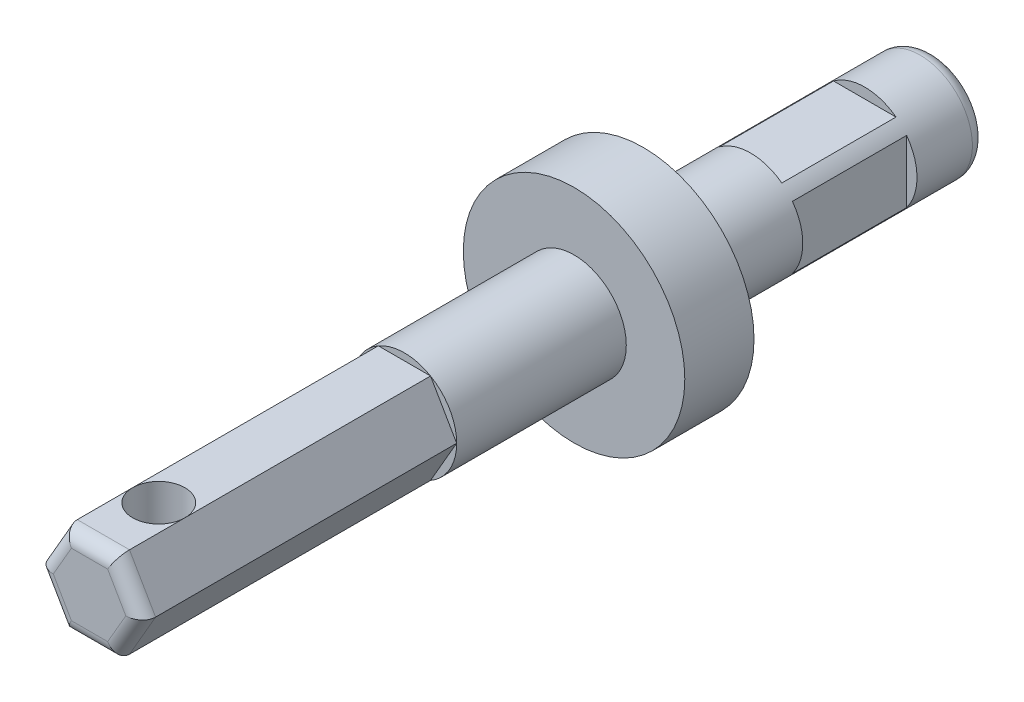
ISO-10303-21;
HEADER;
FILE_DESCRIPTION(('STEP AP214'),'2;1');
FILE_NAME('part.step','',(''),(''),'','','');
FILE_SCHEMA(('AUTOMOTIVE_DESIGN { 1 0 10303 214 1 1 1 1 }'));
ENDSEC;
DATA;
#1=APPLICATION_CONTEXT('core data for automotive mechanical design processes');
#2=APPLICATION_PROTOCOL_DEFINITION('international standard','automotive_design',2000,#1);
#3=PRODUCT_CONTEXT('',#1,'mechanical');
#4=PRODUCT('Part','Part','',(#3));
#5=PRODUCT_RELATED_PRODUCT_CATEGORY('part','',(#4));
#6=PRODUCT_DEFINITION_FORMATION('','',#4);
#7=PRODUCT_DEFINITION_CONTEXT('part definition',#1,'design');
#8=PRODUCT_DEFINITION('design','',#6,#7);
#9=PRODUCT_DEFINITION_SHAPE('','',#8);
#10=(LENGTH_UNIT() NAMED_UNIT(*) SI_UNIT(.MILLI.,.METRE.));
#11=(NAMED_UNIT(*) PLANE_ANGLE_UNIT() SI_UNIT($,.RADIAN.));
#12=(NAMED_UNIT(*) SI_UNIT($,.STERADIAN.) SOLID_ANGLE_UNIT());
#13=UNCERTAINTY_MEASURE_WITH_UNIT(LENGTH_MEASURE(1.E-05),#10,'distance_accuracy_value','');
#14=(GEOMETRIC_REPRESENTATION_CONTEXT(3) GLOBAL_UNCERTAINTY_ASSIGNED_CONTEXT((#13)) GLOBAL_UNIT_ASSIGNED_CONTEXT((#10,
#11,#12)) REPRESENTATION_CONTEXT('',''));
#15=CARTESIAN_POINT('',(0.,0.,0.));
#16=DIRECTION('',(0.,0.,1.));
#17=DIRECTION('',(1.,0.,0.));
#18=AXIS2_PLACEMENT_3D('',#15,#16,#17);
#19=CARTESIAN_POINT('',(1.8865,3.26751384847869,46.));
#20=DIRECTION('',(0.,-1.,0.));
#21=DIRECTION('',(1.,0.,0.));
#22=AXIS2_PLACEMENT_3D('',#19,#20,#21);
#23=PLANE('',#22);
#24=DIRECTION('',(0.,0.,-1.));
#25=VECTOR('',#24,1.);
#26=CARTESIAN_POINT('',(-1.8865,3.26751384847869,46.));
#27=LINE('',#26,#25);
#28=CARTESIAN_POINT('',(-1.8865,3.26751384847869,55.));
#29=VERTEX_POINT('',#28);
#30=CARTESIAN_POINT('',(-1.8865,3.26751384847869,51.));
#31=VERTEX_POINT('',#30);
#32=EDGE_CURVE('E151',#29,#31,#27,.T.);
#33=ORIENTED_EDGE('',*,*,#32,.F.);
#34=DIRECTION('',(-1.,0.,0.));
#35=VECTOR('',#34,1.);
#36=CARTESIAN_POINT('',(1.8865,3.26751384847869,55.));
#37=LINE('',#36,#35);
#38=CARTESIAN_POINT('',(1.8865,3.26751384847869,55.));
#39=VERTEX_POINT('',#38);
#40=EDGE_CURVE('E277',#29,#39,#37,.F.);
#41=ORIENTED_EDGE('',*,*,#40,.T.);
#42=DIRECTION('',(0.,0.,-1.));
#43=VECTOR('',#42,1.);
#44=CARTESIAN_POINT('',(1.8865,3.26751384847869,46.));
#45=LINE('',#44,#43);
#46=CARTESIAN_POINT('',(1.8865,3.26751384847869,51.));
#47=VERTEX_POINT('',#46);
#48=EDGE_CURVE('E179',#39,#47,#45,.T.);
#49=ORIENTED_EDGE('',*,*,#48,.T.);
#50=CARTESIAN_POINT('',(0.,3.26751384847869,51.));
#51=DIRECTION('',(0.,1.,0.));
#52=DIRECTION('',(-1.,0.,0.));
#53=AXIS2_PLACEMENT_3D('',#50,#51,#52);
#54=CIRCLE('',#53,1.8865);
#55=EDGE_CURVE('E173',#31,#47,#54,.T.);
#56=ORIENTED_EDGE('',*,*,#55,.F.);
#57=EDGE_LOOP('',(#33,#41,#49,#56));
#58=FACE_BOUND('',#57,.T.);
#59=ADVANCED_FACE('F44',(#58),#23,.F.);
#60=CARTESIAN_POINT('',(-1.8865,-3.26751384847869,46.));
#61=DIRECTION('',(0.,1.,0.));
#62=DIRECTION('',(-1.,0.,0.));
#63=AXIS2_PLACEMENT_3D('',#60,#61,#62);
#64=PLANE('',#63);
#65=DIRECTION('',(0.,0.,-1.));
#66=VECTOR('',#65,1.);
#67=CARTESIAN_POINT('',(1.8865,-3.26751384847869,46.));
#68=LINE('',#67,#66);
#69=CARTESIAN_POINT('',(1.8865,-3.26751384847869,55.));
#70=VERTEX_POINT('',#69);
#71=CARTESIAN_POINT('',(1.8865,-3.26751384847868,51.));
#72=VERTEX_POINT('',#71);
#73=EDGE_CURVE('E347',#70,#72,#68,.T.);
#74=ORIENTED_EDGE('',*,*,#73,.F.);
#75=DIRECTION('',(1.,0.,0.));
#76=VECTOR('',#75,1.);
#77=CARTESIAN_POINT('',(-1.8865,-3.26751384847869,55.));
#78=LINE('',#77,#76);
#79=CARTESIAN_POINT('',(-1.8865,-3.26751384847869,55.));
#80=VERTEX_POINT('',#79);
#81=EDGE_CURVE('E11',#70,#80,#78,.F.);
#82=ORIENTED_EDGE('',*,*,#81,.T.);
#83=DIRECTION('',(0.,0.,-1.));
#84=VECTOR('',#83,1.);
#85=CARTESIAN_POINT('',(-1.8865,-3.26751384847869,46.));
#86=LINE('',#85,#84);
#87=CARTESIAN_POINT('',(-1.8865,-3.26751384847869,51.));
#88=VERTEX_POINT('',#87);
#89=EDGE_CURVE('E189',#80,#88,#86,.T.);
#90=ORIENTED_EDGE('',*,*,#89,.T.);
#91=CARTESIAN_POINT('',(0.,-3.26751384847869,51.));
#92=DIRECTION('',(0.,1.,0.));
#93=DIRECTION('',(-1.,0.,0.));
#94=AXIS2_PLACEMENT_3D('',#91,#92,#93);
#95=CIRCLE('',#94,1.8865);
#96=EDGE_CURVE('E392',#88,#72,#95,.T.);
#97=ORIENTED_EDGE('',*,*,#96,.T.);
#98=EDGE_LOOP('',(#74,#82,#90,#97));
#99=FACE_BOUND('',#98,.T.);
#100=ADVANCED_FACE('F398',(#99),#64,.F.);
#101=CARTESIAN_POINT('',(0.,0.,8.25));
#102=DIRECTION('',(0.,0.,-1.));
#103=DIRECTION('',(-1.,0.,0.));
#104=AXIS2_PLACEMENT_3D('',#101,#102,#103);
#105=CYLINDRICAL_SURFACE('',#104,3.773);
#106=CARTESIAN_POINT('',(0.,0.,21.));
#107=DIRECTION('',(0.,0.,1.));
#108=DIRECTION('',(1.,0.,0.));
#109=AXIS2_PLACEMENT_3D('',#106,#107,#108);
#110=CIRCLE('',#109,3.773);
#111=CARTESIAN_POINT('',(3.773,0.,21.));
#112=VERTEX_POINT('',#111);
#113=EDGE_CURVE('E249',#112,#112,#110,.T.);
#114=ORIENTED_EDGE('',*,*,#113,.T.);
#115=EDGE_LOOP('',(#114));
#116=FACE_BOUND('',#115,.T.);
#117=CARTESIAN_POINT('',(0.,0.,33.254));
#118=DIRECTION('',(0.,0.,1.));
#119=DIRECTION('',(1.,0.,0.));
#120=AXIS2_PLACEMENT_3D('',#117,#118,#119);
#121=CIRCLE('',#120,3.773);
#122=CARTESIAN_POINT('',(1.8865,-3.26751384847869,33.254));
#123=VERTEX_POINT('',#122);
#124=CARTESIAN_POINT('',(3.773,0.,33.254));
#125=VERTEX_POINT('',#124);
#126=EDGE_CURVE('E373',#123,#125,#121,.T.);
#127=ORIENTED_EDGE('',*,*,#126,.F.);
#128=CARTESIAN_POINT('',(-1.8865,-3.26751384847869,33.254));
#129=VERTEX_POINT('',#128);
#130=EDGE_CURVE('E364',#129,#123,#121,.T.);
#131=ORIENTED_EDGE('',*,*,#130,.F.);
#132=CARTESIAN_POINT('',(-3.773,0.,33.254));
#133=VERTEX_POINT('',#132);
#134=EDGE_CURVE('E370',#133,#129,#121,.T.);
#135=ORIENTED_EDGE('',*,*,#134,.F.);
#136=CARTESIAN_POINT('',(-1.8865,3.26751384847869,33.254));
#137=VERTEX_POINT('',#136);
#138=EDGE_CURVE('E378',#137,#133,#121,.T.);
#139=ORIENTED_EDGE('',*,*,#138,.F.);
#140=CARTESIAN_POINT('',(1.8865,3.26751384847869,33.254));
#141=VERTEX_POINT('',#140);
#142=EDGE_CURVE('E380',#141,#137,#121,.T.);
#143=ORIENTED_EDGE('',*,*,#142,.F.);
#144=EDGE_CURVE('E332',#125,#141,#121,.T.);
#145=ORIENTED_EDGE('',*,*,#144,.F.);
#146=EDGE_LOOP('',(#127,#131,#135,#139,#143,#145));
#147=FACE_BOUND('',#146,.T.);
#148=ADVANCED_FACE('F369',(#116,#147),#105,.T.);
#149=CARTESIAN_POINT('',(0.,0.,33.254));
#150=DIRECTION('',(0.,0.,1.));
#151=DIRECTION('',(1.,0.,0.));
#152=AXIS2_PLACEMENT_3D('',#149,#150,#151);
#153=PLANE('',#152);
#154=DIRECTION('',(0.5,0.866025403784439,0.));
#155=VECTOR('',#154,1.);
#156=CARTESIAN_POINT('',(1.8865,-3.26751384847869,33.254));
#157=LINE('',#156,#155);
#158=EDGE_CURVE('E339',#123,#125,#157,.T.);
#159=ORIENTED_EDGE('',*,*,#158,.F.);
#160=ORIENTED_EDGE('',*,*,#126,.T.);
#161=EDGE_LOOP('',(#159,#160));
#162=FACE_BOUND('',#161,.T.);
#163=ADVANCED_FACE('F403',(#162),#153,.T.);
#164=DIRECTION('',(1.,0.,0.));
#165=VECTOR('',#164,1.);
#166=CARTESIAN_POINT('',(-1.8865,-3.26751384847869,33.254));
#167=LINE('',#166,#165);
#168=EDGE_CURVE('E330',#129,#123,#167,.T.);
#169=ORIENTED_EDGE('',*,*,#168,.F.);
#170=ORIENTED_EDGE('',*,*,#130,.T.);
#171=EDGE_LOOP('',(#169,#170));
#172=FACE_BOUND('',#171,.T.);
#173=ADVANCED_FACE('F363',(#172),#153,.T.);
#174=DIRECTION('',(0.5,-0.866025403784439,0.));
#175=VECTOR('',#174,1.);
#176=CARTESIAN_POINT('',(-3.773,0.,33.254));
#177=LINE('',#176,#175);
#178=EDGE_CURVE('E326',#133,#129,#177,.T.);
#179=ORIENTED_EDGE('',*,*,#178,.F.);
#180=ORIENTED_EDGE('',*,*,#134,.T.);
#181=EDGE_LOOP('',(#179,#180));
#182=FACE_BOUND('',#181,.T.);
#183=ADVANCED_FACE('F376',(#182),#153,.T.);
#184=DIRECTION('',(-0.5,-0.866025403784439,0.));
#185=VECTOR('',#184,1.);
#186=CARTESIAN_POINT('',(-1.8865,3.26751384847869,33.254));
#187=LINE('',#186,#185);
#188=EDGE_CURVE('E321',#137,#133,#187,.T.);
#189=ORIENTED_EDGE('',*,*,#188,.F.);
#190=ORIENTED_EDGE('',*,*,#138,.T.);
#191=EDGE_LOOP('',(#189,#190));
#192=FACE_BOUND('',#191,.T.);
#193=ADVANCED_FACE('F622',(#192),#153,.T.);
#194=DIRECTION('',(-1.,0.,0.));
#195=VECTOR('',#194,1.);
#196=CARTESIAN_POINT('',(1.8865,3.26751384847869,33.254));
#197=LINE('',#196,#195);
#198=EDGE_CURVE('E185',#141,#137,#197,.T.);
#199=ORIENTED_EDGE('',*,*,#198,.F.);
#200=ORIENTED_EDGE('',*,*,#142,.T.);
#201=EDGE_LOOP('',(#199,#200));
#202=FACE_BOUND('',#201,.T.);
#203=ADVANCED_FACE('F455',(#202),#153,.T.);
#204=DIRECTION('',(-0.5,0.866025403784439,0.));
#205=VECTOR('',#204,1.);
#206=CARTESIAN_POINT('',(3.773,0.,33.254));
#207=LINE('',#206,#205);
#208=EDGE_CURVE('E232',#125,#141,#207,.T.);
#209=ORIENTED_EDGE('',*,*,#208,.F.);
#210=ORIENTED_EDGE('',*,*,#144,.T.);
#211=EDGE_LOOP('',(#209,#210));
#212=FACE_BOUND('',#211,.T.);
#213=ADVANCED_FACE('F409',(#212),#153,.T.);
#214=CARTESIAN_POINT('',(3.773,0.,46.));
#215=DIRECTION('',(-0.866025403784438,-0.5,0.));
#216=DIRECTION('',(0.5,-0.866025403784439,0.));
#217=AXIS2_PLACEMENT_3D('',#214,#215,#216);
#218=PLANE('',#217);
#219=ORIENTED_EDGE('',*,*,#48,.F.);
#220=DIRECTION('',(-0.5,0.866025403784439,0.));
#221=VECTOR('',#220,1.);
#222=CARTESIAN_POINT('',(3.773,0.,55.));
#223=LINE('',#222,#221);
#224=CARTESIAN_POINT('',(3.773,0.,55.));
#225=VERTEX_POINT('',#224);
#226=EDGE_CURVE('E273',#39,#225,#223,.F.);
#227=ORIENTED_EDGE('',*,*,#226,.T.);
#228=DIRECTION('',(0.,0.,-1.));
#229=VECTOR('',#228,1.);
#230=CARTESIAN_POINT('',(3.773,0.,46.));
#231=LINE('',#230,#229);
#232=EDGE_CURVE('E343',#225,#125,#231,.T.);
#233=ORIENTED_EDGE('',*,*,#232,.T.);
#234=ORIENTED_EDGE('',*,*,#208,.T.);
#235=EDGE_CURVE('E165',#47,#141,#45,.T.);
#236=ORIENTED_EDGE('',*,*,#235,.F.);
#237=EDGE_LOOP('',(#219,#227,#233,#234,#236));
#238=FACE_BOUND('',#237,.T.);
#239=ADVANCED_FACE('F411',(#238),#218,.F.);
#240=EDGE_CURVE('E157',#31,#137,#27,.T.);
#241=ORIENTED_EDGE('',*,*,#240,.F.);
#242=EDGE_CURVE('E170',#47,#31,#54,.T.);
#243=ORIENTED_EDGE('',*,*,#242,.F.);
#244=ORIENTED_EDGE('',*,*,#235,.T.);
#245=ORIENTED_EDGE('',*,*,#198,.T.);
#246=EDGE_LOOP('',(#241,#243,#244,#245));
#247=FACE_BOUND('',#246,.T.);
#248=ADVANCED_FACE('F183',(#247),#23,.F.);
#249=CARTESIAN_POINT('',(-1.8865,3.26751384847869,46.));
#250=DIRECTION('',(0.866025403784439,-0.5,0.));
#251=DIRECTION('',(0.5,0.866025403784439,0.));
#252=AXIS2_PLACEMENT_3D('',#249,#250,#251);
#253=PLANE('',#252);
#254=DIRECTION('',(0.,0.,-1.));
#255=VECTOR('',#254,1.);
#256=CARTESIAN_POINT('',(-3.773,0.,46.));
#257=LINE('',#256,#255);
#258=CARTESIAN_POINT('',(-3.773,0.,55.));
#259=VERTEX_POINT('',#258);
#260=EDGE_CURVE('E187',#259,#133,#257,.T.);
#261=ORIENTED_EDGE('',*,*,#260,.F.);
#262=DIRECTION('',(-0.5,-0.866025403784439,0.));
#263=VECTOR('',#262,1.);
#264=CARTESIAN_POINT('',(-1.8865,3.26751384847869,55.));
#265=LINE('',#264,#263);
#266=EDGE_CURVE('E160',#259,#29,#265,.F.);
#267=ORIENTED_EDGE('',*,*,#266,.T.);
#268=ORIENTED_EDGE('',*,*,#32,.T.);
#269=ORIENTED_EDGE('',*,*,#240,.T.);
#270=ORIENTED_EDGE('',*,*,#188,.T.);
#271=EDGE_LOOP('',(#261,#267,#268,#269,#270));
#272=FACE_BOUND('',#271,.T.);
#273=ADVANCED_FACE('F154',(#272),#253,.F.);
#274=CARTESIAN_POINT('',(-3.773,0.,46.));
#275=DIRECTION('',(0.866025403784438,0.5,0.));
#276=DIRECTION('',(-0.5,0.866025403784439,0.));
#277=AXIS2_PLACEMENT_3D('',#274,#275,#276);
#278=PLANE('',#277);
#279=ORIENTED_EDGE('',*,*,#89,.F.);
#280=DIRECTION('',(0.5,-0.866025403784439,0.));
#281=VECTOR('',#280,1.);
#282=CARTESIAN_POINT('',(-3.773,0.,55.));
#283=LINE('',#282,#281);
#284=EDGE_CURVE('E282',#80,#259,#283,.F.);
#285=ORIENTED_EDGE('',*,*,#284,.T.);
#286=ORIENTED_EDGE('',*,*,#260,.T.);
#287=ORIENTED_EDGE('',*,*,#178,.T.);
#288=EDGE_CURVE('E349',#88,#129,#86,.T.);
#289=ORIENTED_EDGE('',*,*,#288,.F.);
#290=EDGE_LOOP('',(#279,#285,#286,#287,#289));
#291=FACE_BOUND('',#290,.T.);
#292=ADVANCED_FACE('F317',(#291),#278,.F.);
#293=EDGE_CURVE('E346',#72,#123,#68,.T.);
#294=ORIENTED_EDGE('',*,*,#293,.F.);
#295=EDGE_CURVE('E181',#72,#88,#95,.T.);
#296=ORIENTED_EDGE('',*,*,#295,.T.);
#297=ORIENTED_EDGE('',*,*,#288,.T.);
#298=ORIENTED_EDGE('',*,*,#168,.T.);
#299=EDGE_LOOP('',(#294,#296,#297,#298));
#300=FACE_BOUND('',#299,.T.);
#301=ADVANCED_FACE('F358',(#300),#64,.F.);
#302=CARTESIAN_POINT('',(1.8865,-3.26751384847869,46.));
#303=DIRECTION('',(-0.866025403784439,0.5,0.));
#304=DIRECTION('',(-0.5,-0.866025403784439,0.));
#305=AXIS2_PLACEMENT_3D('',#302,#303,#304);
#306=PLANE('',#305);
#307=ORIENTED_EDGE('',*,*,#232,.F.);
#308=DIRECTION('',(0.5,0.866025403784439,0.));
#309=VECTOR('',#308,1.);
#310=CARTESIAN_POINT('',(1.8865,-3.26751384847868,55.));
#311=LINE('',#310,#309);
#312=EDGE_CURVE('E54',#225,#70,#311,.F.);
#313=ORIENTED_EDGE('',*,*,#312,.T.);
#314=ORIENTED_EDGE('',*,*,#73,.T.);
#315=ORIENTED_EDGE('',*,*,#293,.T.);
#316=ORIENTED_EDGE('',*,*,#158,.T.);
#317=EDGE_LOOP('',(#307,#313,#314,#315,#316));
#318=FACE_BOUND('',#317,.T.);
#319=ADVANCED_FACE('F401',(#318),#306,.F.);
#320=CARTESIAN_POINT('',(0.,0.,56.));
#321=DIRECTION('',(0.,0.,1.));
#322=DIRECTION('',(1.,0.,0.));
#323=AXIS2_PLACEMENT_3D('',#320,#321,#322);
#324=PLANE('',#323);
#325=DIRECTION('',(0.5,0.866025403784439,0.));
#326=VECTOR('',#325,1.);
#327=CARTESIAN_POINT('',(2.90697459621556,0.500000000000001,56.));
#328=LINE('',#327,#326);
#329=CARTESIAN_POINT('',(1.30914973081037,-2.26751384847868,56.));
#330=VERTEX_POINT('',#329);
#331=CARTESIAN_POINT('',(2.61829946162075,0.,56.));
#332=VERTEX_POINT('',#331);
#333=EDGE_CURVE('E257',#330,#332,#328,.T.);
#334=ORIENTED_EDGE('',*,*,#333,.T.);
#335=DIRECTION('',(-0.5,0.866025403784439,0.));
#336=VECTOR('',#335,1.);
#337=CARTESIAN_POINT('',(1.02047459621556,2.76751384847869,56.));
#338=LINE('',#337,#336);
#339=CARTESIAN_POINT('',(1.30914973081037,2.26751384847869,56.));
#340=VERTEX_POINT('',#339);
#341=EDGE_CURVE('E269',#332,#340,#338,.T.);
#342=ORIENTED_EDGE('',*,*,#341,.T.);
#343=DIRECTION('',(-1.,0.,0.));
#344=VECTOR('',#343,1.);
#345=CARTESIAN_POINT('',(-1.8865,2.26751384847868,56.));
#346=LINE('',#345,#344);
#347=CARTESIAN_POINT('',(-1.30914973081037,2.26751384847868,56.));
#348=VERTEX_POINT('',#347);
#349=EDGE_CURVE('E266',#340,#348,#346,.T.);
#350=ORIENTED_EDGE('',*,*,#349,.T.);
#351=DIRECTION('',(-0.5,-0.866025403784439,0.));
#352=VECTOR('',#351,1.);
#353=CARTESIAN_POINT('',(-2.90697459621556,-0.500000000000001,56.));
#354=LINE('',#353,#352);
#355=CARTESIAN_POINT('',(-2.61829946162075,0.,56.));
#356=VERTEX_POINT('',#355);
#357=EDGE_CURVE('E263',#348,#356,#354,.T.);
#358=ORIENTED_EDGE('',*,*,#357,.T.);
#359=DIRECTION('',(0.5,-0.866025403784439,0.));
#360=VECTOR('',#359,1.);
#361=CARTESIAN_POINT('',(-1.02047459621556,-2.76751384847869,56.));
#362=LINE('',#361,#360);
#363=CARTESIAN_POINT('',(-1.30914973081037,-2.26751384847869,56.));
#364=VERTEX_POINT('',#363);
#365=EDGE_CURVE('E260',#356,#364,#362,.T.);
#366=ORIENTED_EDGE('',*,*,#365,.T.);
#367=DIRECTION('',(1.,0.,0.));
#368=VECTOR('',#367,1.);
#369=CARTESIAN_POINT('',(1.8865,-2.26751384847868,56.));
#370=LINE('',#369,#368);
#371=EDGE_CURVE('E248',#364,#330,#370,.T.);
#372=ORIENTED_EDGE('',*,*,#371,.T.);
#373=EDGE_LOOP('',(#334,#342,#350,#358,#366,#372));
#374=FACE_BOUND('',#373,.T.);
#375=ADVANCED_FACE('F423',(#374),#324,.T.);
#376=CARTESIAN_POINT('',(0.,0.,21.));
#377=DIRECTION('',(0.,0.,-1.));
#378=DIRECTION('',(-1.,0.,0.));
#379=AXIS2_PLACEMENT_3D('',#376,#377,#378);
#380=CYLINDRICAL_SURFACE('',#379,8.);
#381=CARTESIAN_POINT('',(0.,0.,21.));
#382=DIRECTION('',(0.,0.,1.));
#383=DIRECTION('',(1.,0.,0.));
#384=AXIS2_PLACEMENT_3D('',#381,#382,#383);
#385=CIRCLE('',#384,8.);
#386=CARTESIAN_POINT('',(8.,0.,21.));
#387=VERTEX_POINT('',#386);
#388=EDGE_CURVE('E254',#387,#387,#385,.T.);
#389=ORIENTED_EDGE('',*,*,#388,.F.);
#390=EDGE_LOOP('',(#389));
#391=FACE_BOUND('',#390,.T.);
#392=CARTESIAN_POINT('',(0.,0.,16.));
#393=DIRECTION('',(0.,0.,1.));
#394=DIRECTION('',(1.,0.,0.));
#395=AXIS2_PLACEMENT_3D('',#392,#393,#394);
#396=CIRCLE('',#395,8.);
#397=CARTESIAN_POINT('',(8.,0.,16.));
#398=VERTEX_POINT('',#397);
#399=EDGE_CURVE('E388',#398,#398,#396,.T.);
#400=ORIENTED_EDGE('',*,*,#399,.T.);
#401=EDGE_LOOP('',(#400));
#402=FACE_BOUND('',#401,.T.);
#403=ADVANCED_FACE('F555',(#391,#402),#380,.T.);
#404=CARTESIAN_POINT('',(0.,0.,21.));
#405=DIRECTION('',(0.,0.,1.));
#406=DIRECTION('',(1.,0.,0.));
#407=AXIS2_PLACEMENT_3D('',#404,#405,#406);
#408=PLANE('',#407);
#409=ORIENTED_EDGE('',*,*,#113,.F.);
#410=EDGE_LOOP('',(#409));
#411=FACE_BOUND('',#410,.T.);
#412=ORIENTED_EDGE('',*,*,#388,.T.);
#413=EDGE_LOOP('',(#412));
#414=FACE_BOUND('',#413,.T.);
#415=ADVANCED_FACE('F546',(#411,#414),#408,.T.);
#416=CARTESIAN_POINT('',(0.,0.,16.));
#417=DIRECTION('',(0.,0.,1.));
#418=DIRECTION('',(1.,0.,0.));
#419=AXIS2_PLACEMENT_3D('',#416,#417,#418);
#420=PLANE('',#419);
#421=CARTESIAN_POINT('',(0.,0.,16.));
#422=DIRECTION('',(0.,0.,1.));
#423=DIRECTION('',(1.,0.,0.));
#424=AXIS2_PLACEMENT_3D('',#421,#422,#423);
#425=CIRCLE('',#424,3.773);
#426=CARTESIAN_POINT('',(3.773,0.,16.));
#427=VERTEX_POINT('',#426);
#428=EDGE_CURVE('E244',#427,#427,#425,.T.);
#429=ORIENTED_EDGE('',*,*,#428,.T.);
#430=EDGE_LOOP('',(#429));
#431=FACE_BOUND('',#430,.T.);
#432=ORIENTED_EDGE('',*,*,#399,.F.);
#433=EDGE_LOOP('',(#432));
#434=FACE_BOUND('',#433,.T.);
#435=ADVANCED_FACE('F541',(#431,#434),#420,.F.);
#436=CARTESIAN_POINT('',(0.,0.,-5.));
#437=DIRECTION('',(0.,0.,-1.));
#438=DIRECTION('',(-1.,0.,0.));
#439=AXIS2_PLACEMENT_3D('',#436,#437,#438);
#440=PLANE('',#439);
#441=CARTESIAN_POINT('',(0.,0.,-5.));
#442=DIRECTION('',(0.,0.,-1.));
#443=DIRECTION('',(-1.,0.,0.));
#444=AXIS2_PLACEMENT_3D('',#441,#442,#443);
#445=CIRCLE('',#444,2.773);
#446=CARTESIAN_POINT('',(-2.773,0.,-5.));
#447=VERTEX_POINT('',#446);
#448=EDGE_CURVE('E236',#447,#447,#445,.T.);
#449=ORIENTED_EDGE('',*,*,#448,.T.);
#450=EDGE_LOOP('',(#449));
#451=FACE_BOUND('',#450,.T.);
#452=ADVANCED_FACE('F480',(#451),#440,.T.);
#453=CARTESIAN_POINT('',(0.,0.,-4.));
#454=DIRECTION('',(0.,0.,-1.));
#455=DIRECTION('',(-1.,0.,0.));
#456=AXIS2_PLACEMENT_3D('',#453,#454,#455);
#457=TOROIDAL_SURFACE('',#456,2.773,1.);
#458=CARTESIAN_POINT('',(0.,0.,-4.));
#459=DIRECTION('',(0.,0.,-1.));
#460=DIRECTION('',(-1.,0.,0.));
#461=AXIS2_PLACEMENT_3D('',#458,#459,#460);
#462=CIRCLE('',#461,3.773);
#463=CARTESIAN_POINT('',(-3.773,0.,-4.));
#464=VERTEX_POINT('',#463);
#465=EDGE_CURVE('E240',#464,#464,#462,.F.);
#466=ORIENTED_EDGE('',*,*,#465,.F.);
#467=EDGE_LOOP('',(#466));
#468=FACE_BOUND('',#467,.T.);
#469=ORIENTED_EDGE('',*,*,#448,.F.);
#470=EDGE_LOOP('',(#469));
#471=FACE_BOUND('',#470,.T.);
#472=ADVANCED_FACE('F477',(#468,#471),#457,.T.);
#473=CARTESIAN_POINT('',(0.,0.,8.25));
#474=DIRECTION('',(0.,0.,1.));
#475=DIRECTION('',(1.,0.,0.));
#476=AXIS2_PLACEMENT_3D('',#473,#474,#475);
#477=PLANE('',#476);
#478=CARTESIAN_POINT('',(0.,0.,8.25));
#479=DIRECTION('',(0.,0.,1.));
#480=DIRECTION('',(1.,0.,0.));
#481=AXIS2_PLACEMENT_3D('',#478,#479,#480);
#482=CIRCLE('',#481,3.773);
#483=CARTESIAN_POINT('',(2.25765364925624,3.023,8.25));
#484=VERTEX_POINT('',#483);
#485=CARTESIAN_POINT('',(-2.25765364925624,3.023,8.25));
#486=VERTEX_POINT('',#485);
#487=EDGE_CURVE('E199',#484,#486,#482,.T.);
#488=ORIENTED_EDGE('',*,*,#487,.F.);
#489=DIRECTION('',(-1.,0.,0.));
#490=VECTOR('',#489,1.);
#491=CARTESIAN_POINT('',(-2.25765364925624,3.023,8.25));
#492=LINE('',#491,#490);
#493=EDGE_CURVE('E200',#484,#486,#492,.T.);
#494=ORIENTED_EDGE('',*,*,#493,.T.);
#495=EDGE_LOOP('',(#488,#494));
#496=FACE_BOUND('',#495,.T.);
#497=ADVANCED_FACE('F464',(#496),#477,.F.);
#498=CARTESIAN_POINT('',(-2.25765364925624,3.023,8.25));
#499=DIRECTION('',(0.,-1.,0.));
#500=DIRECTION('',(0.,0.,-1.));
#501=AXIS2_PLACEMENT_3D('',#498,#499,#500);
#502=PLANE('',#501);
#503=DIRECTION('',(-1.,0.,0.));
#504=VECTOR('',#503,1.);
#505=CARTESIAN_POINT('',(-2.25765364925624,3.023,0.));
#506=LINE('',#505,#504);
#507=CARTESIAN_POINT('',(2.25765364925624,3.023,0.));
#508=VERTEX_POINT('',#507);
#509=CARTESIAN_POINT('',(-2.25765364925624,3.023,0.));
#510=VERTEX_POINT('',#509);
#511=EDGE_CURVE('E210',#508,#510,#506,.T.);
#512=ORIENTED_EDGE('',*,*,#511,.T.);
#513=DIRECTION('',(0.,0.,-1.));
#514=VECTOR('',#513,1.);
#515=CARTESIAN_POINT('',(-2.25765364925624,3.023,8.25));
#516=LINE('',#515,#514);
#517=EDGE_CURVE('E224',#486,#510,#516,.T.);
#518=ORIENTED_EDGE('',*,*,#517,.F.);
#519=ORIENTED_EDGE('',*,*,#493,.F.);
#520=DIRECTION('',(0.,0.,-1.));
#521=VECTOR('',#520,1.);
#522=CARTESIAN_POINT('',(2.25765364925624,3.023,8.25));
#523=LINE('',#522,#521);
#524=EDGE_CURVE('E228',#484,#508,#523,.T.);
#525=ORIENTED_EDGE('',*,*,#524,.T.);
#526=EDGE_LOOP('',(#512,#518,#519,#525));
#527=FACE_BOUND('',#526,.T.);
#528=ADVANCED_FACE('F473',(#527),#502,.F.);
#529=CARTESIAN_POINT('',(0.,0.,0.));
#530=DIRECTION('',(0.,0.,-1.));
#531=DIRECTION('',(-1.,0.,0.));
#532=AXIS2_PLACEMENT_3D('',#529,#530,#531);
#533=PLANE('',#532);
#534=ORIENTED_EDGE('',*,*,#511,.F.);
#535=CARTESIAN_POINT('',(0.,0.,0.));
#536=DIRECTION('',(0.,0.,-1.));
#537=DIRECTION('',(-1.,0.,0.));
#538=AXIS2_PLACEMENT_3D('',#535,#536,#537);
#539=CIRCLE('',#538,3.773);
#540=EDGE_CURVE('E384',#510,#508,#539,.T.);
#541=ORIENTED_EDGE('',*,*,#540,.F.);
#542=EDGE_LOOP('',(#534,#541));
#543=FACE_BOUND('',#542,.T.);
#544=ADVANCED_FACE('F462',(#543),#533,.F.);
#545=CARTESIAN_POINT('',(3.023,-2.25765364925624,8.25));
#546=VERTEX_POINT('',#545);
#547=CARTESIAN_POINT('',(3.023,2.25765364925624,8.25));
#548=VERTEX_POINT('',#547);
#549=EDGE_CURVE('E195',#546,#548,#482,.T.);
#550=ORIENTED_EDGE('',*,*,#549,.F.);
#551=DIRECTION('',(0.,1.,0.));
#552=VECTOR('',#551,1.);
#553=CARTESIAN_POINT('',(3.023,-2.25765364925624,8.25));
#554=LINE('',#553,#552);
#555=EDGE_CURVE('E204',#546,#548,#554,.T.);
#556=ORIENTED_EDGE('',*,*,#555,.T.);
#557=EDGE_LOOP('',(#550,#556));
#558=FACE_BOUND('',#557,.T.);
#559=ADVANCED_FACE('F458',(#558),#477,.F.);
#560=DIRECTION('',(0.,1.,0.));
#561=VECTOR('',#560,1.);
#562=CARTESIAN_POINT('',(3.023,-2.25765364925624,0.));
#563=LINE('',#562,#561);
#564=CARTESIAN_POINT('',(3.023,-2.25765364925624,0.));
#565=VERTEX_POINT('',#564);
#566=CARTESIAN_POINT('',(3.023,2.25765364925624,0.));
#567=VERTEX_POINT('',#566);
#568=EDGE_CURVE('E205',#565,#567,#563,.T.);
#569=ORIENTED_EDGE('',*,*,#568,.F.);
#570=EDGE_CURVE('E253',#567,#565,#539,.T.);
#571=ORIENTED_EDGE('',*,*,#570,.F.);
#572=EDGE_LOOP('',(#569,#571));
#573=FACE_BOUND('',#572,.T.);
#574=ADVANCED_FACE('F461',(#573),#533,.F.);
#575=CARTESIAN_POINT('',(3.023,-2.25765364925624,8.25));
#576=DIRECTION('',(-1.,0.,0.));
#577=DIRECTION('',(0.,0.,1.));
#578=AXIS2_PLACEMENT_3D('',#575,#576,#577);
#579=PLANE('',#578);
#580=ORIENTED_EDGE('',*,*,#568,.T.);
#581=DIRECTION('',(0.,0.,-1.));
#582=VECTOR('',#581,1.);
#583=CARTESIAN_POINT('',(3.023,2.25765364925624,8.25));
#584=LINE('',#583,#582);
#585=EDGE_CURVE('E209',#548,#567,#584,.T.);
#586=ORIENTED_EDGE('',*,*,#585,.F.);
#587=ORIENTED_EDGE('',*,*,#555,.F.);
#588=DIRECTION('',(0.,0.,-1.));
#589=VECTOR('',#588,1.);
#590=CARTESIAN_POINT('',(3.023,-2.25765364925624,8.25));
#591=LINE('',#590,#589);
#592=EDGE_CURVE('E220',#546,#565,#591,.T.);
#593=ORIENTED_EDGE('',*,*,#592,.T.);
#594=EDGE_LOOP('',(#580,#586,#587,#593));
#595=FACE_BOUND('',#594,.T.);
#596=ADVANCED_FACE('F465',(#595),#579,.F.);
#597=ORIENTED_EDGE('',*,*,#585,.T.);
#598=ORIENTED_EDGE('',*,*,#570,.T.);
#599=ORIENTED_EDGE('',*,*,#592,.F.);
#600=ORIENTED_EDGE('',*,*,#549,.T.);
#601=EDGE_LOOP('',(#597,#598,#599,#600));
#602=FACE_BOUND('',#601,.T.);
#603=ORIENTED_EDGE('',*,*,#540,.T.);
#604=ORIENTED_EDGE('',*,*,#524,.F.);
#605=ORIENTED_EDGE('',*,*,#487,.T.);
#606=ORIENTED_EDGE('',*,*,#517,.T.);
#607=EDGE_LOOP('',(#603,#604,#605,#606));
#608=FACE_BOUND('',#607,.T.);
#609=ORIENTED_EDGE('',*,*,#465,.T.);
#610=EDGE_LOOP('',(#609));
#611=FACE_BOUND('',#610,.T.);
#612=ORIENTED_EDGE('',*,*,#428,.F.);
#613=EDGE_LOOP('',(#612));
#614=FACE_BOUND('',#613,.T.);
#615=ADVANCED_FACE('F468',(#602,#608,#611,#614),#105,.T.);
#616=CARTESIAN_POINT('',(0.,-8.,51.));
#617=DIRECTION('',(0.,1.,0.));
#618=DIRECTION('',(-1.,0.,0.));
#619=AXIS2_PLACEMENT_3D('',#616,#617,#618);
#620=CYLINDRICAL_SURFACE('',#619,1.8865);
#621=ORIENTED_EDGE('',*,*,#55,.T.);
#622=ORIENTED_EDGE('',*,*,#242,.T.);
#623=EDGE_LOOP('',(#621,#622));
#624=FACE_BOUND('',#623,.T.);
#625=ORIENTED_EDGE('',*,*,#295,.F.);
#626=ORIENTED_EDGE('',*,*,#96,.F.);
#627=EDGE_LOOP('',(#625,#626));
#628=FACE_BOUND('',#627,.T.);
#629=ADVANCED_FACE('F171',(#624,#628),#620,.F.);
#630=CARTESIAN_POINT('',(-1.96372459621556,-1.13375692423934,55.));
#631=DIRECTION('',(-0.5,0.866025403784439,0.));
#632=DIRECTION('',(-0.866025403784438,-0.5,0.));
#633=AXIS2_PLACEMENT_3D('',#630,#631,#632);
#634=CYLINDRICAL_SURFACE('',#633,1.);
#635=CARTESIAN_POINT('',(-2.61829946162075,0.,55.));
#636=DIRECTION('',(0.,1.,0.));
#637=DIRECTION('',(-1.,0.,0.));
#638=AXIS2_PLACEMENT_3D('',#635,#636,#637);
#639=ELLIPSE('',#638,1.15470053837925,1.);
#640=EDGE_CURVE('E300',#259,#356,#639,.T.);
#641=ORIENTED_EDGE('',*,*,#640,.F.);
#642=ORIENTED_EDGE('',*,*,#284,.F.);
#643=CARTESIAN_POINT('',(-1.30914973081037,-2.26751384847869,55.));
#644=DIRECTION('',(-0.866025403784439,0.5,0.));
#645=DIRECTION('',(-0.5,-0.866025403784439,0.));
#646=AXIS2_PLACEMENT_3D('',#643,#644,#645);
#647=ELLIPSE('',#646,1.15470053837925,1.);
#648=EDGE_CURVE('E48',#364,#80,#647,.F.);
#649=ORIENTED_EDGE('',*,*,#648,.F.);
#650=ORIENTED_EDGE('',*,*,#365,.F.);
#651=EDGE_LOOP('',(#641,#642,#649,#650));
#652=FACE_BOUND('',#651,.T.);
#653=ADVANCED_FACE('F46',(#652),#634,.T.);
#654=CARTESIAN_POINT('',(0.,-2.26751384847869,55.));
#655=DIRECTION('',(-1.,0.,0.));
#656=DIRECTION('',(0.,-1.,0.));
#657=AXIS2_PLACEMENT_3D('',#654,#655,#656);
#658=CYLINDRICAL_SURFACE('',#657,1.);
#659=ORIENTED_EDGE('',*,*,#648,.T.);
#660=ORIENTED_EDGE('',*,*,#81,.F.);
#661=CARTESIAN_POINT('',(1.30914973081037,-2.26751384847869,55.));
#662=DIRECTION('',(-0.866025403784438,-0.5,0.));
#663=DIRECTION('',(-0.5,0.866025403784439,0.));
#664=AXIS2_PLACEMENT_3D('',#661,#662,#663);
#665=ELLIPSE('',#664,1.15470053837925,1.);
#666=EDGE_CURVE('E297',#330,#70,#665,.F.);
#667=ORIENTED_EDGE('',*,*,#666,.F.);
#668=ORIENTED_EDGE('',*,*,#371,.F.);
#669=EDGE_LOOP('',(#659,#660,#667,#668));
#670=FACE_BOUND('',#669,.T.);
#671=ADVANCED_FACE('F311',(#670),#658,.T.);
#672=CARTESIAN_POINT('',(-1.96372459621556,1.13375692423934,55.));
#673=DIRECTION('',(0.5,0.866025403784439,0.));
#674=DIRECTION('',(-0.866025403784439,0.5,0.));
#675=AXIS2_PLACEMENT_3D('',#672,#673,#674);
#676=CYLINDRICAL_SURFACE('',#675,1.);
#677=ORIENTED_EDGE('',*,*,#640,.T.);
#678=ORIENTED_EDGE('',*,*,#357,.F.);
#679=CARTESIAN_POINT('',(-1.30914973081037,2.26751384847869,55.));
#680=DIRECTION('',(0.866025403784439,0.5,0.));
#681=DIRECTION('',(-0.5,0.866025403784439,0.));
#682=AXIS2_PLACEMENT_3D('',#679,#680,#681);
#683=ELLIPSE('',#682,1.15470053837925,1.);
#684=EDGE_CURVE('E293',#29,#348,#683,.T.);
#685=ORIENTED_EDGE('',*,*,#684,.F.);
#686=ORIENTED_EDGE('',*,*,#266,.F.);
#687=EDGE_LOOP('',(#677,#678,#685,#686));
#688=FACE_BOUND('',#687,.T.);
#689=ADVANCED_FACE('F428',(#688),#676,.T.);
#690=CARTESIAN_POINT('',(1.96372459621556,-1.13375692423934,55.));
#691=DIRECTION('',(-0.5,-0.866025403784439,0.));
#692=DIRECTION('',(0.866025403784439,-0.5,0.));
#693=AXIS2_PLACEMENT_3D('',#690,#691,#692);
#694=CYLINDRICAL_SURFACE('',#693,1.);
#695=ORIENTED_EDGE('',*,*,#666,.T.);
#696=ORIENTED_EDGE('',*,*,#312,.F.);
#697=CARTESIAN_POINT('',(2.61829946162075,0.,55.));
#698=DIRECTION('',(0.,-1.,0.));
#699=DIRECTION('',(-1.,0.,0.));
#700=AXIS2_PLACEMENT_3D('',#697,#698,#699);
#701=ELLIPSE('',#700,1.15470053837925,1.);
#702=EDGE_CURVE('E290',#332,#225,#701,.F.);
#703=ORIENTED_EDGE('',*,*,#702,.F.);
#704=ORIENTED_EDGE('',*,*,#333,.F.);
#705=EDGE_LOOP('',(#695,#696,#703,#704));
#706=FACE_BOUND('',#705,.T.);
#707=ADVANCED_FACE('F426',(#706),#694,.T.);
#708=CARTESIAN_POINT('',(0.,2.26751384847869,55.));
#709=DIRECTION('',(1.,0.,0.));
#710=DIRECTION('',(0.,1.,0.));
#711=AXIS2_PLACEMENT_3D('',#708,#709,#710);
#712=CYLINDRICAL_SURFACE('',#711,1.);
#713=ORIENTED_EDGE('',*,*,#684,.T.);
#714=ORIENTED_EDGE('',*,*,#349,.F.);
#715=CARTESIAN_POINT('',(1.30914973081037,2.26751384847869,55.));
#716=DIRECTION('',(0.866025403784439,-0.5,0.));
#717=DIRECTION('',(0.5,0.866025403784439,0.));
#718=AXIS2_PLACEMENT_3D('',#715,#716,#717);
#719=ELLIPSE('',#718,1.15470053837925,1.);
#720=EDGE_CURVE('E287',#39,#340,#719,.T.);
#721=ORIENTED_EDGE('',*,*,#720,.F.);
#722=ORIENTED_EDGE('',*,*,#40,.F.);
#723=EDGE_LOOP('',(#713,#714,#721,#722));
#724=FACE_BOUND('',#723,.T.);
#725=ADVANCED_FACE('F421',(#724),#712,.T.);
#726=CARTESIAN_POINT('',(1.96372459621556,1.13375692423934,55.));
#727=DIRECTION('',(0.5,-0.866025403784439,0.));
#728=DIRECTION('',(0.866025403784438,0.5,0.));
#729=AXIS2_PLACEMENT_3D('',#726,#727,#728);
#730=CYLINDRICAL_SURFACE('',#729,1.);
#731=ORIENTED_EDGE('',*,*,#702,.T.);
#732=ORIENTED_EDGE('',*,*,#226,.F.);
#733=ORIENTED_EDGE('',*,*,#720,.T.);
#734=ORIENTED_EDGE('',*,*,#341,.F.);
#735=EDGE_LOOP('',(#731,#732,#733,#734));
#736=FACE_BOUND('',#735,.T.);
#737=ADVANCED_FACE('F415',(#736),#730,.T.);
#738=CLOSED_SHELL('',(#59,#100,#148,#163,#173,#183,#193,#203,#213,#239,#248,#273,#292,#301,#319,
#375,#403,#415,#435,#452,#472,#497,#528,#544,#559,#574,#596,#615,#629,#653,#671,#689,#707,#725,#737));
#739=MANIFOLD_SOLID_BREP('B2',#738);
#740=ADVANCED_BREP_SHAPE_REPRESENTATION('',(#18,#739),#14);
#741=SHAPE_DEFINITION_REPRESENTATION(#9,#740);
ENDSEC;
END-ISO-10303-21;
